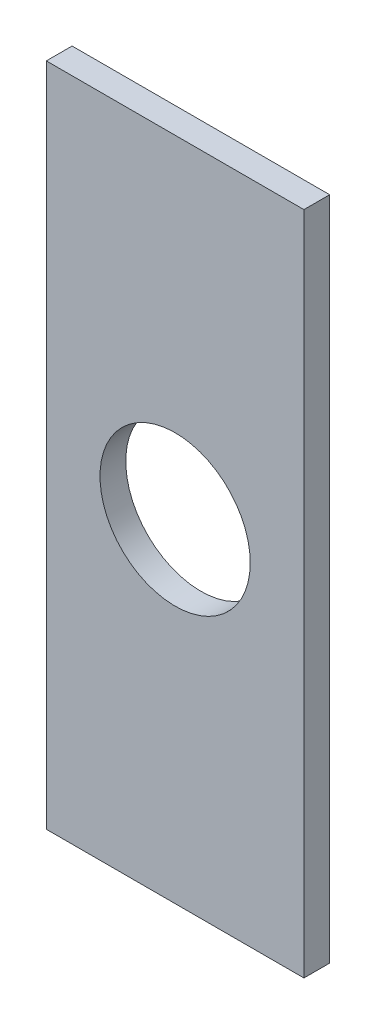
ISO-10303-21;
HEADER;
FILE_DESCRIPTION(('STEP AP214'),'2;1');
FILE_NAME('part.step','',(''),(''),'','','');
FILE_SCHEMA(('AUTOMOTIVE_DESIGN { 1 0 10303 214 1 1 1 1 }'));
ENDSEC;
DATA;
#1=APPLICATION_CONTEXT('core data for automotive mechanical design processes');
#2=APPLICATION_PROTOCOL_DEFINITION('international standard','automotive_design',2000,#1);
#3=PRODUCT_CONTEXT('',#1,'mechanical');
#4=PRODUCT('Part','Part','',(#3));
#5=PRODUCT_RELATED_PRODUCT_CATEGORY('part','',(#4));
#6=PRODUCT_DEFINITION_FORMATION('','',#4);
#7=PRODUCT_DEFINITION_CONTEXT('part definition',#1,'design');
#8=PRODUCT_DEFINITION('design','',#6,#7);
#9=PRODUCT_DEFINITION_SHAPE('','',#8);
#10=(LENGTH_UNIT() NAMED_UNIT(*) SI_UNIT(.MILLI.,.METRE.));
#11=(NAMED_UNIT(*) PLANE_ANGLE_UNIT() SI_UNIT($,.RADIAN.));
#12=(NAMED_UNIT(*) SI_UNIT($,.STERADIAN.) SOLID_ANGLE_UNIT());
#13=UNCERTAINTY_MEASURE_WITH_UNIT(LENGTH_MEASURE(1.E-05),#10,'distance_accuracy_value','');
#14=(GEOMETRIC_REPRESENTATION_CONTEXT(3) GLOBAL_UNCERTAINTY_ASSIGNED_CONTEXT((#13)) GLOBAL_UNIT_ASSIGNED_CONTEXT((#10,
#11,#12)) REPRESENTATION_CONTEXT('',''));
#15=CARTESIAN_POINT('',(0.,0.,0.));
#16=DIRECTION('',(0.,0.,1.));
#17=DIRECTION('',(1.,0.,0.));
#18=AXIS2_PLACEMENT_3D('',#15,#16,#17);
#19=CARTESIAN_POINT('',(0.,0.,12.));
#20=DIRECTION('',(0.,0.,1.));
#21=DIRECTION('',(1.,0.,0.));
#22=AXIS2_PLACEMENT_3D('',#19,#20,#21);
#23=PLANE('',#22);
#24=DIRECTION('',(0.,1.,0.));
#25=VECTOR('',#24,1.);
#26=CARTESIAN_POINT('',(60.,155.,12.));
#27=LINE('',#26,#25);
#28=CARTESIAN_POINT('',(60.,-155.,12.));
#29=VERTEX_POINT('',#28);
#30=CARTESIAN_POINT('',(60.,155.,12.));
#31=VERTEX_POINT('',#30);
#32=EDGE_CURVE('E86',#29,#31,#27,.T.);
#33=ORIENTED_EDGE('',*,*,#32,.T.);
#34=DIRECTION('',(-1.,0.,0.));
#35=VECTOR('',#34,1.);
#36=CARTESIAN_POINT('',(-60.,155.,12.));
#37=LINE('',#36,#35);
#38=CARTESIAN_POINT('',(-60.,155.,12.));
#39=VERTEX_POINT('',#38);
#40=EDGE_CURVE('E81',#31,#39,#37,.T.);
#41=ORIENTED_EDGE('',*,*,#40,.T.);
#42=DIRECTION('',(0.,-1.,0.));
#43=VECTOR('',#42,1.);
#44=CARTESIAN_POINT('',(-60.,155.,12.));
#45=LINE('',#44,#43);
#46=CARTESIAN_POINT('',(-60.,-155.,12.));
#47=VERTEX_POINT('',#46);
#48=EDGE_CURVE('E84',#39,#47,#45,.T.);
#49=ORIENTED_EDGE('',*,*,#48,.T.);
#50=DIRECTION('',(1.,0.,0.));
#51=VECTOR('',#50,1.);
#52=CARTESIAN_POINT('',(-60.,-155.,12.));
#53=LINE('',#52,#51);
#54=EDGE_CURVE('E51',#47,#29,#53,.T.);
#55=ORIENTED_EDGE('',*,*,#54,.T.);
#56=EDGE_LOOP('',(#33,#41,#49,#55));
#57=FACE_BOUND('',#56,.T.);
#58=CARTESIAN_POINT('',(0.,0.,12.));
#59=DIRECTION('',(0.,0.,1.));
#60=DIRECTION('',(1.,0.,0.));
#61=AXIS2_PLACEMENT_3D('',#58,#59,#60);
#62=CIRCLE('',#61,35.);
#63=CARTESIAN_POINT('',(35.,0.,12.));
#64=VERTEX_POINT('',#63);
#65=EDGE_CURVE('E101',#64,#64,#62,.T.);
#66=ORIENTED_EDGE('',*,*,#65,.F.);
#67=EDGE_LOOP('',(#66));
#68=FACE_BOUND('',#67,.T.);
#69=ADVANCED_FACE('F34',(#57,#68),#23,.T.);
#70=CARTESIAN_POINT('',(0.,0.,0.));
#71=DIRECTION('',(0.,0.,1.));
#72=DIRECTION('',(1.,0.,0.));
#73=AXIS2_PLACEMENT_3D('',#70,#71,#72);
#74=PLANE('',#73);
#75=DIRECTION('',(0.,1.,0.));
#76=VECTOR('',#75,1.);
#77=CARTESIAN_POINT('',(60.,155.,0.));
#78=LINE('',#77,#76);
#79=CARTESIAN_POINT('',(60.,-155.,0.));
#80=VERTEX_POINT('',#79);
#81=CARTESIAN_POINT('',(60.,155.,0.));
#82=VERTEX_POINT('',#81);
#83=EDGE_CURVE('E98',#80,#82,#78,.T.);
#84=ORIENTED_EDGE('',*,*,#83,.F.);
#85=DIRECTION('',(1.,0.,0.));
#86=VECTOR('',#85,1.);
#87=CARTESIAN_POINT('',(-60.,-155.,0.));
#88=LINE('',#87,#86);
#89=CARTESIAN_POINT('',(-60.,-155.,0.));
#90=VERTEX_POINT('',#89);
#91=EDGE_CURVE('E74',#90,#80,#88,.T.);
#92=ORIENTED_EDGE('',*,*,#91,.F.);
#93=DIRECTION('',(0.,-1.,0.));
#94=VECTOR('',#93,1.);
#95=CARTESIAN_POINT('',(-60.,155.,0.));
#96=LINE('',#95,#94);
#97=CARTESIAN_POINT('',(-60.,155.,0.));
#98=VERTEX_POINT('',#97);
#99=EDGE_CURVE('E68',#98,#90,#96,.T.);
#100=ORIENTED_EDGE('',*,*,#99,.F.);
#101=DIRECTION('',(-1.,0.,0.));
#102=VECTOR('',#101,1.);
#103=CARTESIAN_POINT('',(-60.,155.,0.));
#104=LINE('',#103,#102);
#105=EDGE_CURVE('E90',#82,#98,#104,.T.);
#106=ORIENTED_EDGE('',*,*,#105,.F.);
#107=EDGE_LOOP('',(#84,#92,#100,#106));
#108=FACE_BOUND('',#107,.T.);
#109=CARTESIAN_POINT('',(0.,0.,0.));
#110=DIRECTION('',(0.,0.,1.));
#111=DIRECTION('',(1.,0.,0.));
#112=AXIS2_PLACEMENT_3D('',#109,#110,#111);
#113=CIRCLE('',#112,35.);
#114=CARTESIAN_POINT('',(35.,0.,0.));
#115=VERTEX_POINT('',#114);
#116=EDGE_CURVE('E113',#115,#115,#113,.T.);
#117=ORIENTED_EDGE('',*,*,#116,.T.);
#118=EDGE_LOOP('',(#117));
#119=FACE_BOUND('',#118,.T.);
#120=ADVANCED_FACE('F109',(#108,#119),#74,.F.);
#121=CARTESIAN_POINT('',(60.,155.,12.));
#122=DIRECTION('',(-1.,0.,0.));
#123=DIRECTION('',(0.,-1.,0.));
#124=AXIS2_PLACEMENT_3D('',#121,#122,#123);
#125=PLANE('',#124);
#126=ORIENTED_EDGE('',*,*,#83,.T.);
#127=DIRECTION('',(0.,0.,-1.));
#128=VECTOR('',#127,1.);
#129=CARTESIAN_POINT('',(60.,155.,12.));
#130=LINE('',#129,#128);
#131=EDGE_CURVE('E11',#31,#82,#130,.T.);
#132=ORIENTED_EDGE('',*,*,#131,.F.);
#133=ORIENTED_EDGE('',*,*,#32,.F.);
#134=DIRECTION('',(0.,0.,-1.));
#135=VECTOR('',#134,1.);
#136=CARTESIAN_POINT('',(60.,-155.,12.));
#137=LINE('',#136,#135);
#138=EDGE_CURVE('E94',#29,#80,#137,.T.);
#139=ORIENTED_EDGE('',*,*,#138,.T.);
#140=EDGE_LOOP('',(#126,#132,#133,#139));
#141=FACE_BOUND('',#140,.T.);
#142=ADVANCED_FACE('F36',(#141),#125,.F.);
#143=CARTESIAN_POINT('',(-60.,155.,12.));
#144=DIRECTION('',(0.,-1.,0.));
#145=DIRECTION('',(1.,0.,0.));
#146=AXIS2_PLACEMENT_3D('',#143,#144,#145);
#147=PLANE('',#146);
#148=ORIENTED_EDGE('',*,*,#105,.T.);
#149=DIRECTION('',(0.,0.,-1.));
#150=VECTOR('',#149,1.);
#151=CARTESIAN_POINT('',(-60.,155.,12.));
#152=LINE('',#151,#150);
#153=EDGE_CURVE('E43',#39,#98,#152,.T.);
#154=ORIENTED_EDGE('',*,*,#153,.F.);
#155=ORIENTED_EDGE('',*,*,#40,.F.);
#156=ORIENTED_EDGE('',*,*,#131,.T.);
#157=EDGE_LOOP('',(#148,#154,#155,#156));
#158=FACE_BOUND('',#157,.T.);
#159=ADVANCED_FACE('F89',(#158),#147,.F.);
#160=CARTESIAN_POINT('',(-60.,155.,12.));
#161=DIRECTION('',(1.,0.,0.));
#162=DIRECTION('',(0.,1.,0.));
#163=AXIS2_PLACEMENT_3D('',#160,#161,#162);
#164=PLANE('',#163);
#165=ORIENTED_EDGE('',*,*,#99,.T.);
#166=DIRECTION('',(0.,0.,-1.));
#167=VECTOR('',#166,1.);
#168=CARTESIAN_POINT('',(-60.,-155.,12.));
#169=LINE('',#168,#167);
#170=EDGE_CURVE('E91',#47,#90,#169,.T.);
#171=ORIENTED_EDGE('',*,*,#170,.F.);
#172=ORIENTED_EDGE('',*,*,#48,.F.);
#173=ORIENTED_EDGE('',*,*,#153,.T.);
#174=EDGE_LOOP('',(#165,#171,#172,#173));
#175=FACE_BOUND('',#174,.T.);
#176=ADVANCED_FACE('F92',(#175),#164,.F.);
#177=CARTESIAN_POINT('',(-60.,-155.,12.));
#178=DIRECTION('',(0.,1.,0.));
#179=DIRECTION('',(0.,0.,1.));
#180=AXIS2_PLACEMENT_3D('',#177,#178,#179);
#181=PLANE('',#180);
#182=ORIENTED_EDGE('',*,*,#91,.T.);
#183=ORIENTED_EDGE('',*,*,#138,.F.);
#184=ORIENTED_EDGE('',*,*,#54,.F.);
#185=ORIENTED_EDGE('',*,*,#170,.T.);
#186=EDGE_LOOP('',(#182,#183,#184,#185));
#187=FACE_BOUND('',#186,.T.);
#188=ADVANCED_FACE('F106',(#187),#181,.F.);
#189=CARTESIAN_POINT('',(0.,0.,12.));
#190=DIRECTION('',(0.,0.,-1.));
#191=DIRECTION('',(-1.,0.,0.));
#192=AXIS2_PLACEMENT_3D('',#189,#190,#191);
#193=CYLINDRICAL_SURFACE('',#192,35.);
#194=ORIENTED_EDGE('',*,*,#65,.T.);
#195=EDGE_LOOP('',(#194));
#196=FACE_BOUND('',#195,.T.);
#197=ORIENTED_EDGE('',*,*,#116,.F.);
#198=EDGE_LOOP('',(#197));
#199=FACE_BOUND('',#198,.T.);
#200=ADVANCED_FACE('F119',(#196,#199),#193,.F.);
#201=CLOSED_SHELL('',(#69,#120,#142,#159,#176,#188,#200));
#202=MANIFOLD_SOLID_BREP('B2',#201);
#203=ADVANCED_BREP_SHAPE_REPRESENTATION('',(#18,#202),#14);
#204=SHAPE_DEFINITION_REPRESENTATION(#9,#203);
ENDSEC;
END-ISO-10303-21;
